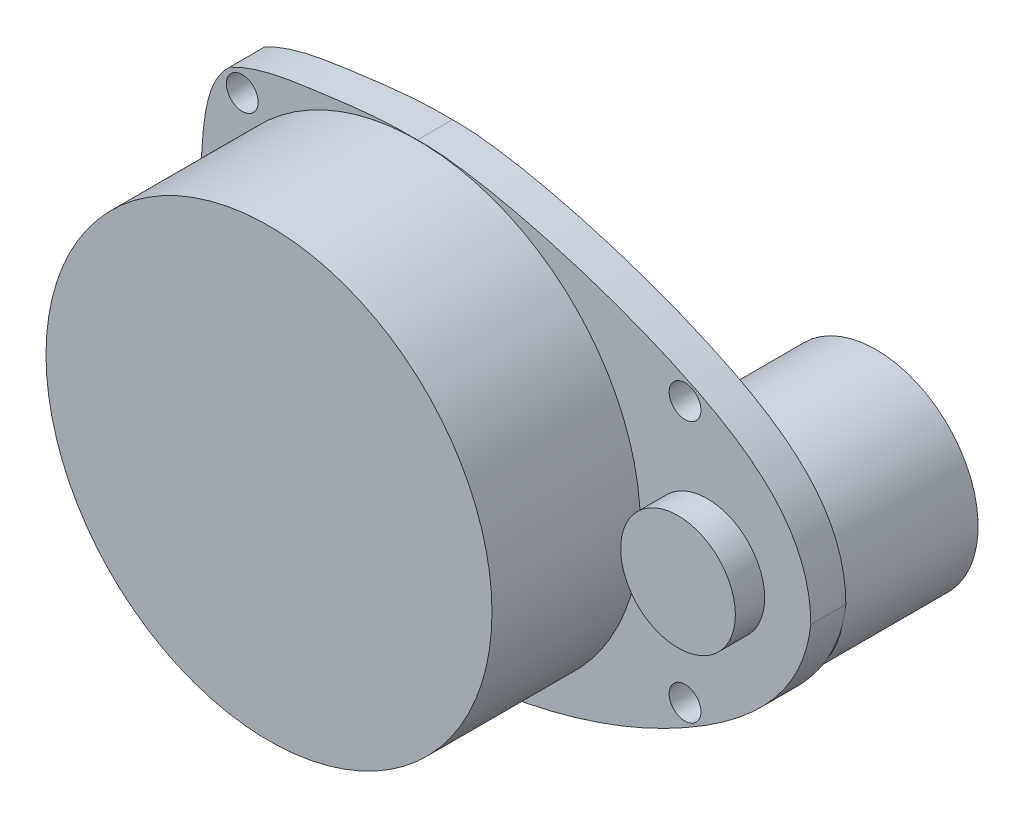
ISO-10303-21;
HEADER;
FILE_DESCRIPTION(('STEP AP214'),'2;1');
FILE_NAME('part.step','',(''),(''),'','','');
FILE_SCHEMA(('AUTOMOTIVE_DESIGN { 1 0 10303 214 1 1 1 1 }'));
ENDSEC;
DATA;
#1=APPLICATION_CONTEXT('core data for automotive mechanical design processes');
#2=APPLICATION_PROTOCOL_DEFINITION('international standard','automotive_design',2000,#1);
#3=PRODUCT_CONTEXT('',#1,'mechanical');
#4=PRODUCT('Part','Part','',(#3));
#5=PRODUCT_RELATED_PRODUCT_CATEGORY('part','',(#4));
#6=PRODUCT_DEFINITION_FORMATION('','',#4);
#7=PRODUCT_DEFINITION_CONTEXT('part definition',#1,'design');
#8=PRODUCT_DEFINITION('design','',#6,#7);
#9=PRODUCT_DEFINITION_SHAPE('','',#8);
#10=(LENGTH_UNIT() NAMED_UNIT(*) SI_UNIT(.MILLI.,.METRE.));
#11=(NAMED_UNIT(*) PLANE_ANGLE_UNIT() SI_UNIT($,.RADIAN.));
#12=(NAMED_UNIT(*) SI_UNIT($,.STERADIAN.) SOLID_ANGLE_UNIT());
#13=UNCERTAINTY_MEASURE_WITH_UNIT(LENGTH_MEASURE(1.E-05),#10,'distance_accuracy_value','');
#14=(GEOMETRIC_REPRESENTATION_CONTEXT(3) GLOBAL_UNCERTAINTY_ASSIGNED_CONTEXT((#13)) GLOBAL_UNIT_ASSIGNED_CONTEXT((#10,
#11,#12)) REPRESENTATION_CONTEXT('',''));
#15=CARTESIAN_POINT('',(0.,0.,0.));
#16=DIRECTION('',(0.,0.,1.));
#17=DIRECTION('',(1.,0.,0.));
#18=AXIS2_PLACEMENT_3D('',#15,#16,#17);
#19=CARTESIAN_POINT('',(57.3208513460756,3.33511866903232,5.5));
#20=DIRECTION('',(0.,0.,1.));
#21=DIRECTION('',(1.,0.,0.));
#22=AXIS2_PLACEMENT_3D('',#19,#20,#21);
#23=PLANE('',#22);
#24=CARTESIAN_POINT('',(7.5,7.5,5.5));
#25=DIRECTION('',(0.,0.,1.));
#26=DIRECTION('',(1.,0.,0.));
#27=AXIS2_PLACEMENT_3D('',#24,#25,#26);
#28=CIRCLE('',#27,2.5);
#29=CARTESIAN_POINT('',(10.,7.5,5.5));
#30=VERTEX_POINT('',#29);
#31=EDGE_CURVE('E154',#30,#30,#28,.T.);
#32=ORIENTED_EDGE('',*,*,#31,.F.);
#33=EDGE_LOOP('',(#32));
#34=FACE_BOUND('',#33,.T.);
#35=CARTESIAN_POINT('',(5.09220399977392,5.66435324977228,5.5));
#36=CARTESIAN_POINT('',(14.1236779546398,0.659923036704694,5.5));
#37=CARTESIAN_POINT('',(40.0411645187666,-1.58169355672719,5.5));
#38=CARTESIAN_POINT('',(74.6783381143802,6.38686659384342,5.5));
#39=CARTESIAN_POINT('',(95.5774445104806,24.4378411658884,5.5));
#40=CARTESIAN_POINT('',(96.74,35.14,5.5));
#41=B_SPLINE_CURVE_WITH_KNOTS('',3,(#35,#36,#37,#38,#39,#40),.UNSPECIFIED.,.F.,.F.,(4,1,1,4),
(0.,0.287852140913227,0.70662431940175,1.),.UNSPECIFIED.);
#42=CARTESIAN_POINT('',(5.09220399977392,5.66435324977228,5.5));
#43=VERTEX_POINT('',#42);
#44=CARTESIAN_POINT('',(34.3930324280933,0.118405562780248,5.5));
#45=VERTEX_POINT('',#44);
#46=EDGE_CURVE('E175',#43,#45,#41,.T.);
#47=ORIENTED_EDGE('',*,*,#46,.T.);
#48=CARTESIAN_POINT('',(35.,35.113142172257,5.5));
#49=DIRECTION('',(0.,0.,1.));
#50=DIRECTION('',(1.,0.,0.));
#51=AXIS2_PLACEMENT_3D('',#48,#49,#50);
#52=CIRCLE('',#51,35.);
#53=CARTESIAN_POINT('',(1.06556251253109E-05,35.1404532258015,5.5));
#54=VERTEX_POINT('',#53);
#55=EDGE_CURVE('E50',#45,#54,#52,.F.);
#56=ORIENTED_EDGE('',*,*,#55,.T.);
#57=CARTESIAN_POINT('',(5.5135822504326,65.2901149901861,5.5));
#58=CARTESIAN_POINT('',(1.6113046295502,61.6629074571397,5.5));
#59=CARTESIAN_POINT('',(1.25070297068518,49.9992720277259,5.5));
#60=CARTESIAN_POINT('',(-0.53543711152156,34.426866805757,5.5));
#61=CARTESIAN_POINT('',(0.654932347467396,19.1656531120035,5.5));
#62=CARTESIAN_POINT('',(2.92250129700241,9.27123467474524,5.5));
#63=CARTESIAN_POINT('',(5.09220399977392,5.66435324977228,5.5));
#64=B_SPLINE_CURVE_WITH_KNOTS('',3,(#57,#58,#59,#60,#61,#62,#63),.UNSPECIFIED.,.F.,.F.,(4,1,1,1,
4),(0.,0.257205490140466,0.505904817249593,0.797009019162571,1.),.UNSPECIFIED.);
#65=EDGE_CURVE('E223',#54,#43,#64,.T.);
#66=ORIENTED_EDGE('',*,*,#65,.T.);
#67=EDGE_LOOP('',(#47,#56,#66));
#68=FACE_BOUND('',#67,.T.);
#69=ADVANCED_FACE('F39',(#34,#68),#23,.T.);
#70=DIRECTION('',(0.,0.,-1.));
#71=VECTOR('',#70,1.);
#72=SURFACE_OF_LINEAR_EXTRUSION('',#41,#71);
#73=CARTESIAN_POINT('',(5.09220399977392,5.66435324977228,0.));
#74=CARTESIAN_POINT('',(14.1236779546398,0.659923036704694,0.));
#75=CARTESIAN_POINT('',(40.0411645187666,-1.58169355672719,0.));
#76=CARTESIAN_POINT('',(74.6783381143802,6.38686659384342,0.));
#77=CARTESIAN_POINT('',(95.5774445104806,24.4378411658884,0.));
#78=CARTESIAN_POINT('',(96.74,35.14,0.));
#79=B_SPLINE_CURVE_WITH_KNOTS('',3,(#73,#74,#75,#76,#77,#78),.UNSPECIFIED.,.F.,.F.,(4,1,1,4),
(0.,0.287852140913227,0.70662431940175,1.),.UNSPECIFIED.);
#80=CARTESIAN_POINT('',(5.09220399977392,5.66435324977228,0.));
#81=VERTEX_POINT('',#80);
#82=CARTESIAN_POINT('',(93.8175280619694,26.2718859773535,0.));
#83=VERTEX_POINT('',#82);
#84=EDGE_CURVE('E107',#81,#83,#79,.T.);
#85=ORIENTED_EDGE('',*,*,#84,.T.);
#86=CARTESIAN_POINT('',(96.2539634107647,32.3448905473509,0.));
#87=VERTEX_POINT('',#86);
#88=EDGE_CURVE('E102',#83,#87,#79,.T.);
#89=ORIENTED_EDGE('',*,*,#88,.T.);
#90=CARTESIAN_POINT('',(96.74,35.14,0.));
#91=VERTEX_POINT('',#90);
#92=EDGE_CURVE('E104',#87,#91,#79,.T.);
#93=ORIENTED_EDGE('',*,*,#92,.T.);
#94=DIRECTION('',(0.,0.,-1.));
#95=VECTOR('',#94,1.);
#96=CARTESIAN_POINT('',(96.74,35.14,5.5));
#97=LINE('',#96,#95);
#98=CARTESIAN_POINT('',(96.74,35.14,5.5));
#99=VERTEX_POINT('',#98);
#100=EDGE_CURVE('E266',#99,#91,#97,.T.);
#101=ORIENTED_EDGE('',*,*,#100,.F.);
#102=CARTESIAN_POINT('',(39.372604666396,0.387354514791777,5.5));
#103=VERTEX_POINT('',#102);
#104=EDGE_CURVE('E184',#103,#99,#41,.T.);
#105=ORIENTED_EDGE('',*,*,#104,.F.);
#106=EDGE_CURVE('E183',#45,#103,#41,.T.);
#107=ORIENTED_EDGE('',*,*,#106,.F.);
#108=ORIENTED_EDGE('',*,*,#46,.F.);
#109=DIRECTION('',(0.,0.,-1.));
#110=VECTOR('',#109,1.);
#111=CARTESIAN_POINT('',(5.09220399977392,5.66435324977228,5.5));
#112=LINE('',#111,#110);
#113=EDGE_CURVE('E221',#43,#81,#112,.T.);
#114=ORIENTED_EDGE('',*,*,#113,.T.);
#115=EDGE_LOOP('',(#85,#89,#93,#101,#105,#107,#108,#114));
#116=FACE_BOUND('',#115,.T.);
#117=ADVANCED_FACE('F41',(#116),#72,.F.);
#118=CARTESIAN_POINT('',(96.74,35.14,5.5));
#119=CARTESIAN_POINT('',(96.7009666038703,46.9148288856809,5.5));
#120=CARTESIAN_POINT('',(76.6692438732577,62.5329091252336,5.5));
#121=CARTESIAN_POINT('',(43.1867218071057,70.4538152972769,5.5));
#122=CARTESIAN_POINT('',(35.,70.14,5.5));
#123=B_SPLINE_CURVE_WITH_KNOTS('',3,(#118,#119,#120,#121,#122),.UNSPECIFIED.,.F.,.F.,(4,1,4),
(0.,0.4201189680841,1.),.UNSPECIFIED.);
#124=DIRECTION('',(0.,0.,-1.));
#125=VECTOR('',#124,1.);
#126=SURFACE_OF_LINEAR_EXTRUSION('',#123,#125);
#127=CARTESIAN_POINT('',(96.74,35.14,0.));
#128=CARTESIAN_POINT('',(96.7009666038703,46.9148288856809,0.));
#129=CARTESIAN_POINT('',(76.6692438732577,62.5329091252336,0.));
#130=CARTESIAN_POINT('',(43.1867218071057,70.4538152972769,0.));
#131=CARTESIAN_POINT('',(35.,70.14,0.));
#132=B_SPLINE_CURVE_WITH_KNOTS('',3,(#127,#128,#129,#130,#131),.UNSPECIFIED.,.F.,.F.,(4,1,4),
(0.,0.4201189680841,1.),.UNSPECIFIED.);
#133=CARTESIAN_POINT('',(35.,70.14,0.));
#134=VERTEX_POINT('',#133);
#135=EDGE_CURVE('E116',#91,#134,#132,.T.);
#136=ORIENTED_EDGE('',*,*,#135,.T.);
#137=DIRECTION('',(0.,0.,-1.));
#138=VECTOR('',#137,1.);
#139=CARTESIAN_POINT('',(35.,70.14,5.5));
#140=LINE('',#139,#138);
#141=CARTESIAN_POINT('',(35.,70.14,5.5));
#142=VERTEX_POINT('',#141);
#143=EDGE_CURVE('E263',#142,#134,#140,.T.);
#144=ORIENTED_EDGE('',*,*,#143,.F.);
#145=EDGE_CURVE('E182',#99,#142,#123,.T.);
#146=ORIENTED_EDGE('',*,*,#145,.F.);
#147=ORIENTED_EDGE('',*,*,#100,.T.);
#148=EDGE_LOOP('',(#136,#144,#146,#147));
#149=FACE_BOUND('',#148,.T.);
#150=ADVANCED_FACE('F201',(#149),#126,.F.);
#151=CARTESIAN_POINT('',(35.,70.14,5.5));
#152=CARTESIAN_POINT('',(29.8992214602806,70.296066513823,5.5));
#153=CARTESIAN_POINT('',(19.6296507438049,68.9898236212704,5.5));
#154=CARTESIAN_POINT('',(9.64145179356835,67.5142023824126,5.5));
#155=CARTESIAN_POINT('',(5.5135822504326,65.2901149901861,5.5));
#156=B_SPLINE_CURVE_WITH_KNOTS('',3,(#151,#152,#153,#154,#155),.UNSPECIFIED.,.F.,.F.,(4,1,4),
(0.,0.536066818880122,1.),.UNSPECIFIED.);
#157=DIRECTION('',(0.,0.,-1.));
#158=VECTOR('',#157,1.);
#159=SURFACE_OF_LINEAR_EXTRUSION('',#156,#158);
#160=CARTESIAN_POINT('',(35.,70.14,0.));
#161=CARTESIAN_POINT('',(29.8992214602806,70.296066513823,0.));
#162=CARTESIAN_POINT('',(19.6296507438049,68.9898236212704,0.));
#163=CARTESIAN_POINT('',(9.64145179356835,67.5142023824126,0.));
#164=CARTESIAN_POINT('',(5.5135822504326,65.2901149901861,0.));
#165=B_SPLINE_CURVE_WITH_KNOTS('',3,(#160,#161,#162,#163,#164),.UNSPECIFIED.,.F.,.F.,(4,1,4),
(0.,0.536066818880122,1.),.UNSPECIFIED.);
#166=CARTESIAN_POINT('',(5.5135822504326,65.2901149901861,0.));
#167=VERTEX_POINT('',#166);
#168=EDGE_CURVE('E238',#134,#167,#165,.T.);
#169=ORIENTED_EDGE('',*,*,#168,.T.);
#170=DIRECTION('',(0.,0.,-1.));
#171=VECTOR('',#170,1.);
#172=CARTESIAN_POINT('',(5.5135822504326,65.2901149901861,5.5));
#173=LINE('',#172,#171);
#174=CARTESIAN_POINT('',(5.5135822504326,65.2901149901861,5.5));
#175=VERTEX_POINT('',#174);
#176=EDGE_CURVE('E259',#175,#167,#173,.T.);
#177=ORIENTED_EDGE('',*,*,#176,.F.);
#178=EDGE_CURVE('E193',#142,#175,#156,.T.);
#179=ORIENTED_EDGE('',*,*,#178,.F.);
#180=ORIENTED_EDGE('',*,*,#143,.T.);
#181=EDGE_LOOP('',(#169,#177,#179,#180));
#182=FACE_BOUND('',#181,.T.);
#183=ADVANCED_FACE('F204',(#182),#159,.F.);
#184=DIRECTION('',(0.,0.,-1.));
#185=VECTOR('',#184,1.);
#186=SURFACE_OF_LINEAR_EXTRUSION('',#64,#185);
#187=CARTESIAN_POINT('',(5.5135822504326,65.2901149901861,0.));
#188=CARTESIAN_POINT('',(1.6113046295502,61.6629074571397,0.));
#189=CARTESIAN_POINT('',(1.25070297068518,49.9992720277259,0.));
#190=CARTESIAN_POINT('',(-0.53543711152156,34.426866805757,0.));
#191=CARTESIAN_POINT('',(0.654932347467396,19.1656531120035,0.));
#192=CARTESIAN_POINT('',(2.92250129700241,9.27123467474524,0.));
#193=CARTESIAN_POINT('',(5.09220399977392,5.66435324977228,0.));
#194=B_SPLINE_CURVE_WITH_KNOTS('',3,(#187,#188,#189,#190,#191,#192,#193),.UNSPECIFIED.,.F.,.F.,
(4,1,1,1,4),(0.,0.257205490140466,0.505904817249593,0.797009019162571,1.),.UNSPECIFIED.);
#195=EDGE_CURVE('E246',#167,#81,#194,.T.);
#196=ORIENTED_EDGE('',*,*,#195,.T.);
#197=ORIENTED_EDGE('',*,*,#113,.F.);
#198=ORIENTED_EDGE('',*,*,#65,.F.);
#199=CARTESIAN_POINT('',(0.0974057159187705,37.7225314189622,5.5));
#200=VERTEX_POINT('',#199);
#201=EDGE_CURVE('E222',#200,#54,#64,.T.);
#202=ORIENTED_EDGE('',*,*,#201,.F.);
#203=EDGE_CURVE('E215',#175,#200,#64,.T.);
#204=ORIENTED_EDGE('',*,*,#203,.F.);
#205=ORIENTED_EDGE('',*,*,#176,.T.);
#206=EDGE_LOOP('',(#196,#197,#198,#202,#204,#205));
#207=FACE_BOUND('',#206,.T.);
#208=ADVANCED_FACE('F208',(#207),#186,.F.);
#209=CARTESIAN_POINT('',(80.5,35.14,5.5));
#210=DIRECTION('',(0.,0.,1.));
#211=DIRECTION('',(1.,0.,0.));
#212=AXIS2_PLACEMENT_3D('',#209,#210,#211);
#213=CIRCLE('',#212,9.);
#214=CARTESIAN_POINT('',(89.5,35.14,5.5));
#215=VERTEX_POINT('',#214);
#216=EDGE_CURVE('E133',#215,#215,#213,.T.);
#217=ORIENTED_EDGE('',*,*,#216,.F.);
#218=EDGE_LOOP('',(#217));
#219=FACE_BOUND('',#218,.T.);
#220=CARTESIAN_POINT('',(7.5,62.78,5.5));
#221=DIRECTION('',(0.,0.,1.));
#222=DIRECTION('',(1.,0.,0.));
#223=AXIS2_PLACEMENT_3D('',#220,#221,#222);
#224=CIRCLE('',#223,2.5);
#225=CARTESIAN_POINT('',(10.,62.78,5.5));
#226=VERTEX_POINT('',#225);
#227=EDGE_CURVE('E146',#226,#226,#224,.T.);
#228=ORIENTED_EDGE('',*,*,#227,.F.);
#229=EDGE_LOOP('',(#228));
#230=FACE_BOUND('',#229,.T.);
#231=CARTESIAN_POINT('',(77.,14.64,5.5));
#232=DIRECTION('',(0.,0.,1.));
#233=DIRECTION('',(1.,0.,0.));
#234=AXIS2_PLACEMENT_3D('',#231,#232,#233);
#235=CIRCLE('',#234,2.50000000000001);
#236=CARTESIAN_POINT('',(79.5,14.64,5.5));
#237=VERTEX_POINT('',#236);
#238=EDGE_CURVE('E162',#237,#237,#235,.T.);
#239=ORIENTED_EDGE('',*,*,#238,.F.);
#240=EDGE_LOOP('',(#239));
#241=FACE_BOUND('',#240,.T.);
#242=CARTESIAN_POINT('',(77.,55.64,5.5));
#243=DIRECTION('',(0.,0.,1.));
#244=DIRECTION('',(1.,0.,0.));
#245=AXIS2_PLACEMENT_3D('',#242,#243,#244);
#246=CIRCLE('',#245,2.50000000000001);
#247=CARTESIAN_POINT('',(79.5,55.64,5.5));
#248=VERTEX_POINT('',#247);
#249=EDGE_CURVE('E142',#248,#248,#246,.T.);
#250=ORIENTED_EDGE('',*,*,#249,.F.);
#251=EDGE_LOOP('',(#250));
#252=FACE_BOUND('',#251,.T.);
#253=ORIENTED_EDGE('',*,*,#203,.T.);
#254=EDGE_CURVE('E44',#200,#103,#52,.F.);
#255=ORIENTED_EDGE('',*,*,#254,.T.);
#256=ORIENTED_EDGE('',*,*,#104,.T.);
#257=ORIENTED_EDGE('',*,*,#145,.T.);
#258=ORIENTED_EDGE('',*,*,#178,.T.);
#259=EDGE_LOOP('',(#253,#255,#256,#257,#258));
#260=FACE_BOUND('',#259,.T.);
#261=ADVANCED_FACE('F212',(#219,#230,#241,#252,#260),#23,.T.);
#262=CARTESIAN_POINT('',(57.3208513460756,3.33511866903232,0.));
#263=DIRECTION('',(0.,0.,1.));
#264=DIRECTION('',(1.,0.,0.));
#265=AXIS2_PLACEMENT_3D('',#262,#263,#264);
#266=PLANE('',#265);
#267=CARTESIAN_POINT('',(80.5,35.14,0.));
#268=DIRECTION('',(0.,0.,-1.));
#269=DIRECTION('',(-1.,0.,0.));
#270=AXIS2_PLACEMENT_3D('',#267,#268,#269);
#271=CIRCLE('',#270,16.);
#272=EDGE_CURVE('E11',#83,#87,#271,.T.);
#273=ORIENTED_EDGE('',*,*,#272,.F.);
#274=ORIENTED_EDGE('',*,*,#84,.F.);
#275=ORIENTED_EDGE('',*,*,#195,.F.);
#276=ORIENTED_EDGE('',*,*,#168,.F.);
#277=ORIENTED_EDGE('',*,*,#135,.F.);
#278=ORIENTED_EDGE('',*,*,#92,.F.);
#279=EDGE_LOOP('',(#273,#274,#275,#276,#277,#278));
#280=FACE_BOUND('',#279,.T.);
#281=CARTESIAN_POINT('',(7.5,62.78,0.));
#282=DIRECTION('',(0.,0.,1.));
#283=DIRECTION('',(1.,0.,0.));
#284=AXIS2_PLACEMENT_3D('',#281,#282,#283);
#285=CIRCLE('',#284,2.5);
#286=CARTESIAN_POINT('',(10.,62.78,0.));
#287=VERTEX_POINT('',#286);
#288=EDGE_CURVE('E119',#287,#287,#285,.F.);
#289=ORIENTED_EDGE('',*,*,#288,.F.);
#290=EDGE_LOOP('',(#289));
#291=FACE_BOUND('',#290,.T.);
#292=CARTESIAN_POINT('',(7.5,7.5,0.));
#293=DIRECTION('',(0.,0.,1.));
#294=DIRECTION('',(1.,0.,0.));
#295=AXIS2_PLACEMENT_3D('',#292,#293,#294);
#296=CIRCLE('',#295,2.5);
#297=CARTESIAN_POINT('',(10.,7.5,0.));
#298=VERTEX_POINT('',#297);
#299=EDGE_CURVE('E150',#298,#298,#296,.F.);
#300=ORIENTED_EDGE('',*,*,#299,.F.);
#301=EDGE_LOOP('',(#300));
#302=FACE_BOUND('',#301,.T.);
#303=CARTESIAN_POINT('',(77.,14.64,0.));
#304=DIRECTION('',(0.,0.,1.));
#305=DIRECTION('',(1.,0.,0.));
#306=AXIS2_PLACEMENT_3D('',#303,#304,#305);
#307=CIRCLE('',#306,2.50000000000001);
#308=CARTESIAN_POINT('',(79.5,14.64,0.));
#309=VERTEX_POINT('',#308);
#310=EDGE_CURVE('E158',#309,#309,#307,.F.);
#311=ORIENTED_EDGE('',*,*,#310,.F.);
#312=EDGE_LOOP('',(#311));
#313=FACE_BOUND('',#312,.T.);
#314=CARTESIAN_POINT('',(77.,55.64,0.));
#315=DIRECTION('',(0.,0.,1.));
#316=DIRECTION('',(1.,0.,0.));
#317=AXIS2_PLACEMENT_3D('',#314,#315,#316);
#318=CIRCLE('',#317,2.50000000000001);
#319=CARTESIAN_POINT('',(79.5,55.64,0.));
#320=VERTEX_POINT('',#319);
#321=EDGE_CURVE('E166',#320,#320,#318,.F.);
#322=ORIENTED_EDGE('',*,*,#321,.F.);
#323=EDGE_LOOP('',(#322));
#324=FACE_BOUND('',#323,.T.);
#325=ADVANCED_FACE('F113',(#280,#291,#302,#313,#324),#266,.F.);
#326=CARTESIAN_POINT('',(77.,55.64,-7.07106781186551));
#327=DIRECTION('',(0.,0.,1.));
#328=DIRECTION('',(1.,0.,0.));
#329=AXIS2_PLACEMENT_3D('',#326,#327,#328);
#330=CYLINDRICAL_SURFACE('',#329,2.50000000000001);
#331=ORIENTED_EDGE('',*,*,#321,.T.);
#332=EDGE_LOOP('',(#331));
#333=FACE_BOUND('',#332,.T.);
#334=ORIENTED_EDGE('',*,*,#249,.T.);
#335=EDGE_LOOP('',(#334));
#336=FACE_BOUND('',#335,.T.);
#337=ADVANCED_FACE('F321',(#333,#336),#330,.F.);
#338=CARTESIAN_POINT('',(77.,14.64,-7.07106781186551));
#339=DIRECTION('',(0.,0.,1.));
#340=DIRECTION('',(1.,0.,0.));
#341=AXIS2_PLACEMENT_3D('',#338,#339,#340);
#342=CYLINDRICAL_SURFACE('',#341,2.50000000000001);
#343=ORIENTED_EDGE('',*,*,#310,.T.);
#344=EDGE_LOOP('',(#343));
#345=FACE_BOUND('',#344,.T.);
#346=ORIENTED_EDGE('',*,*,#238,.T.);
#347=EDGE_LOOP('',(#346));
#348=FACE_BOUND('',#347,.T.);
#349=ADVANCED_FACE('F331',(#345,#348),#342,.F.);
#350=CARTESIAN_POINT('',(7.5,7.5,-7.07106781186551));
#351=DIRECTION('',(0.,0.,1.));
#352=DIRECTION('',(1.,0.,0.));
#353=AXIS2_PLACEMENT_3D('',#350,#351,#352);
#354=CYLINDRICAL_SURFACE('',#353,2.5);
#355=ORIENTED_EDGE('',*,*,#299,.T.);
#356=EDGE_LOOP('',(#355));
#357=FACE_BOUND('',#356,.T.);
#358=ORIENTED_EDGE('',*,*,#31,.T.);
#359=EDGE_LOOP('',(#358));
#360=FACE_BOUND('',#359,.T.);
#361=ADVANCED_FACE('F336',(#357,#360),#354,.F.);
#362=CARTESIAN_POINT('',(7.5,62.78,-7.07106781186551));
#363=DIRECTION('',(0.,0.,1.));
#364=DIRECTION('',(1.,0.,0.));
#365=AXIS2_PLACEMENT_3D('',#362,#363,#364);
#366=CYLINDRICAL_SURFACE('',#365,2.5);
#367=ORIENTED_EDGE('',*,*,#288,.T.);
#368=EDGE_LOOP('',(#367));
#369=FACE_BOUND('',#368,.T.);
#370=ORIENTED_EDGE('',*,*,#227,.T.);
#371=EDGE_LOOP('',(#370));
#372=FACE_BOUND('',#371,.T.);
#373=ADVANCED_FACE('F342',(#369,#372),#366,.F.);
#374=CARTESIAN_POINT('',(80.5,35.14,10.1));
#375=DIRECTION('',(0.,0.,-1.));
#376=DIRECTION('',(-1.,0.,0.));
#377=AXIS2_PLACEMENT_3D('',#374,#375,#376);
#378=CYLINDRICAL_SURFACE('',#377,9.);
#379=CARTESIAN_POINT('',(80.5,35.14,10.1));
#380=DIRECTION('',(0.,0.,1.));
#381=DIRECTION('',(1.,0.,0.));
#382=AXIS2_PLACEMENT_3D('',#379,#380,#381);
#383=CIRCLE('',#382,9.);
#384=CARTESIAN_POINT('',(89.5,35.14,10.1));
#385=VERTEX_POINT('',#384);
#386=EDGE_CURVE('E138',#385,#385,#383,.T.);
#387=ORIENTED_EDGE('',*,*,#386,.F.);
#388=EDGE_LOOP('',(#387));
#389=FACE_BOUND('',#388,.T.);
#390=ORIENTED_EDGE('',*,*,#216,.T.);
#391=EDGE_LOOP('',(#390));
#392=FACE_BOUND('',#391,.T.);
#393=ADVANCED_FACE('F304',(#389,#392),#378,.T.);
#394=CARTESIAN_POINT('',(80.5,35.14,10.1));
#395=DIRECTION('',(0.,0.,1.));
#396=DIRECTION('',(1.,0.,0.));
#397=AXIS2_PLACEMENT_3D('',#394,#395,#396);
#398=PLANE('',#397);
#399=ORIENTED_EDGE('',*,*,#386,.T.);
#400=EDGE_LOOP('',(#399));
#401=FACE_BOUND('',#400,.T.);
#402=ADVANCED_FACE('F296',(#401),#398,.T.);
#403=CARTESIAN_POINT('',(35.,35.113142172257,5.5));
#404=DIRECTION('',(0.,0.,1.));
#405=DIRECTION('',(1.,0.,0.));
#406=AXIS2_PLACEMENT_3D('',#403,#404,#405);
#407=PLANE('',#406);
#408=CARTESIAN_POINT('',(35.,35.113142172257,5.5));
#409=DIRECTION('',(0.,0.,1.));
#410=DIRECTION('',(1.,0.,0.));
#411=AXIS2_PLACEMENT_3D('',#408,#409,#410);
#412=CIRCLE('',#411,35.);
#413=EDGE_CURVE('E65',#45,#103,#412,.T.);
#414=ORIENTED_EDGE('',*,*,#413,.F.);
#415=ORIENTED_EDGE('',*,*,#106,.T.);
#416=EDGE_LOOP('',(#414,#415));
#417=FACE_BOUND('',#416,.T.);
#418=ADVANCED_FACE('F293',(#417),#407,.F.);
#419=EDGE_CURVE('E134',#200,#54,#412,.T.);
#420=ORIENTED_EDGE('',*,*,#419,.F.);
#421=ORIENTED_EDGE('',*,*,#201,.T.);
#422=EDGE_LOOP('',(#420,#421));
#423=FACE_BOUND('',#422,.T.);
#424=ADVANCED_FACE('F295',(#423),#407,.F.);
#425=CARTESIAN_POINT('',(35.,35.113142172257,28.8));
#426=DIRECTION('',(0.,0.,-1.));
#427=DIRECTION('',(-1.,0.,0.));
#428=AXIS2_PLACEMENT_3D('',#425,#426,#427);
#429=CYLINDRICAL_SURFACE('',#428,35.);
#430=CARTESIAN_POINT('',(35.,35.113142172257,28.8));
#431=DIRECTION('',(0.,0.,1.));
#432=DIRECTION('',(1.,0.,0.));
#433=AXIS2_PLACEMENT_3D('',#430,#431,#432);
#434=CIRCLE('',#433,35.);
#435=CARTESIAN_POINT('',(70.,35.113142172257,28.8));
#436=VERTEX_POINT('',#435);
#437=EDGE_CURVE('E129',#436,#436,#434,.T.);
#438=ORIENTED_EDGE('',*,*,#437,.F.);
#439=EDGE_LOOP('',(#438));
#440=FACE_BOUND('',#439,.T.);
#441=ORIENTED_EDGE('',*,*,#419,.T.);
#442=ORIENTED_EDGE('',*,*,#55,.F.);
#443=ORIENTED_EDGE('',*,*,#413,.T.);
#444=ORIENTED_EDGE('',*,*,#254,.F.);
#445=EDGE_LOOP('',(#441,#442,#443,#444));
#446=FACE_BOUND('',#445,.T.);
#447=ADVANCED_FACE('F302',(#440,#446),#429,.T.);
#448=CARTESIAN_POINT('',(35.,35.113142172257,28.8));
#449=DIRECTION('',(0.,0.,1.));
#450=DIRECTION('',(1.,0.,0.));
#451=AXIS2_PLACEMENT_3D('',#448,#449,#450);
#452=PLANE('',#451);
#453=ORIENTED_EDGE('',*,*,#437,.T.);
#454=EDGE_LOOP('',(#453));
#455=FACE_BOUND('',#454,.T.);
#456=ADVANCED_FACE('F350',(#455),#452,.T.);
#457=CARTESIAN_POINT('',(80.5,35.14,-21.));
#458=DIRECTION('',(0.,0.,1.));
#459=DIRECTION('',(1.,0.,0.));
#460=AXIS2_PLACEMENT_3D('',#457,#458,#459);
#461=CYLINDRICAL_SURFACE('',#460,16.);
#462=CARTESIAN_POINT('',(80.5,35.14,-21.));
#463=DIRECTION('',(0.,0.,-1.));
#464=DIRECTION('',(-1.,0.,0.));
#465=AXIS2_PLACEMENT_3D('',#462,#463,#464);
#466=CIRCLE('',#465,16.);
#467=CARTESIAN_POINT('',(64.5,35.14,-21.));
#468=VERTEX_POINT('',#467);
#469=EDGE_CURVE('E124',#468,#468,#466,.T.);
#470=ORIENTED_EDGE('',*,*,#469,.F.);
#471=EDGE_LOOP('',(#470));
#472=FACE_BOUND('',#471,.T.);
#473=EDGE_CURVE('E52',#87,#83,#271,.T.);
#474=ORIENTED_EDGE('',*,*,#473,.T.);
#475=ORIENTED_EDGE('',*,*,#272,.T.);
#476=EDGE_LOOP('',(#474,#475));
#477=FACE_BOUND('',#476,.T.);
#478=ADVANCED_FACE('F121',(#472,#477),#461,.T.);
#479=CARTESIAN_POINT('',(80.5,35.14,-21.));
#480=DIRECTION('',(0.,0.,-1.));
#481=DIRECTION('',(-1.,0.,0.));
#482=AXIS2_PLACEMENT_3D('',#479,#480,#481);
#483=PLANE('',#482);
#484=ORIENTED_EDGE('',*,*,#469,.T.);
#485=EDGE_LOOP('',(#484));
#486=FACE_BOUND('',#485,.T.);
#487=ADVANCED_FACE('F361',(#486),#483,.T.);
#488=CARTESIAN_POINT('',(80.5,35.14,0.));
#489=DIRECTION('',(0.,0.,-1.));
#490=DIRECTION('',(-1.,0.,0.));
#491=AXIS2_PLACEMENT_3D('',#488,#489,#490);
#492=PLANE('',#491);
#493=ORIENTED_EDGE('',*,*,#88,.F.);
#494=ORIENTED_EDGE('',*,*,#473,.F.);
#495=EDGE_LOOP('',(#493,#494));
#496=FACE_BOUND('',#495,.T.);
#497=ADVANCED_FACE('F122',(#496),#492,.F.);
#498=CLOSED_SHELL('',(#69,#117,#150,#183,#208,#261,#325,#337,#349,#361,#373,#393,#402,#418,#424,
#447,#456,#478,#487,#497));
#499=MANIFOLD_SOLID_BREP('B2',#498);
#500=ADVANCED_BREP_SHAPE_REPRESENTATION('',(#18,#499),#14);
#501=SHAPE_DEFINITION_REPRESENTATION(#9,#500);
ENDSEC;
END-ISO-10303-21;
